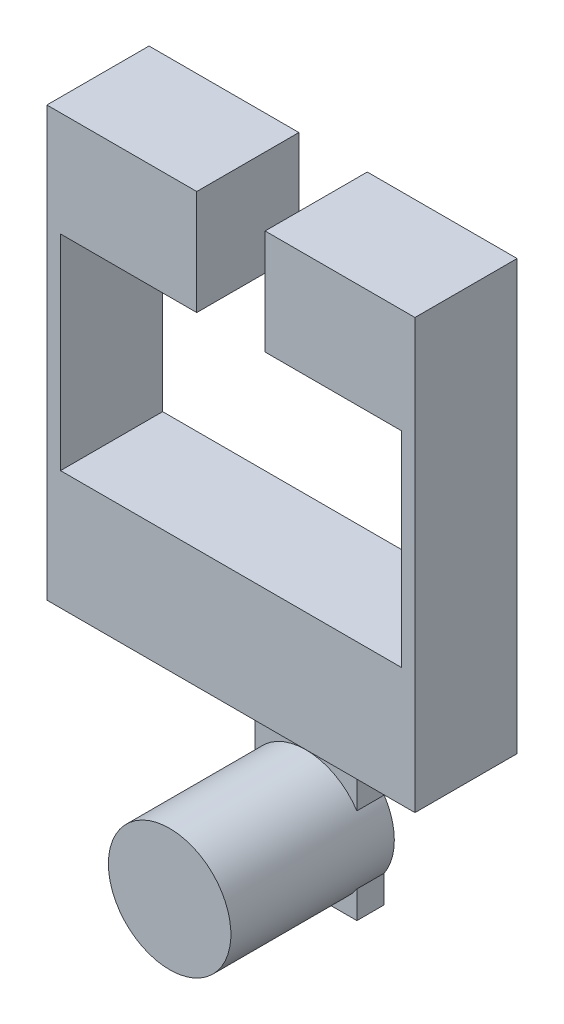
ISO-10303-21;
HEADER;
FILE_DESCRIPTION(('STEP AP214'),'2;1');
FILE_NAME('part.step','',(''),(''),'','','');
FILE_SCHEMA(('AUTOMOTIVE_DESIGN { 1 0 10303 214 1 1 1 1 }'));
ENDSEC;
DATA;
#1=APPLICATION_CONTEXT('core data for automotive mechanical design processes');
#2=APPLICATION_PROTOCOL_DEFINITION('international standard','automotive_design',2000,#1);
#3=PRODUCT_CONTEXT('',#1,'mechanical');
#4=PRODUCT('Part','Part','',(#3));
#5=PRODUCT_RELATED_PRODUCT_CATEGORY('part','',(#4));
#6=PRODUCT_DEFINITION_FORMATION('','',#4);
#7=PRODUCT_DEFINITION_CONTEXT('part definition',#1,'design');
#8=PRODUCT_DEFINITION('design','',#6,#7);
#9=PRODUCT_DEFINITION_SHAPE('','',#8);
#10=(LENGTH_UNIT() NAMED_UNIT(*) SI_UNIT(.MILLI.,.METRE.));
#11=(NAMED_UNIT(*) PLANE_ANGLE_UNIT() SI_UNIT($,.RADIAN.));
#12=(NAMED_UNIT(*) SI_UNIT($,.STERADIAN.) SOLID_ANGLE_UNIT());
#13=UNCERTAINTY_MEASURE_WITH_UNIT(LENGTH_MEASURE(1.E-05),#10,'distance_accuracy_value','');
#14=(GEOMETRIC_REPRESENTATION_CONTEXT(3) GLOBAL_UNCERTAINTY_ASSIGNED_CONTEXT((#13)) GLOBAL_UNIT_ASSIGNED_CONTEXT((#10,
#11,#12)) REPRESENTATION_CONTEXT('',''));
#15=CARTESIAN_POINT('',(0.,0.,0.));
#16=DIRECTION('',(0.,0.,1.));
#17=DIRECTION('',(1.,0.,0.));
#18=AXIS2_PLACEMENT_3D('',#15,#16,#17);
#19=CARTESIAN_POINT('',(9.52499999999999,0.,-4.445));
#20=DIRECTION('',(1.,0.,0.));
#21=DIRECTION('',(0.,1.,0.));
#22=AXIS2_PLACEMENT_3D('',#19,#20,#21);
#23=PLANE('',#22);
#24=DIRECTION('',(0.,0.,-1.));
#25=VECTOR('',#24,1.);
#26=CARTESIAN_POINT('',(9.52499999999998,-31.706675377923,20.955));
#27=LINE('',#26,#25);
#28=CARTESIAN_POINT('',(9.52499999999998,-31.706675377923,-4.445));
#29=VERTEX_POINT('',#28);
#30=CARTESIAN_POINT('',(9.52499999999998,-31.706675377923,-9.525));
#31=VERTEX_POINT('',#30);
#32=EDGE_CURVE('E197',#29,#31,#27,.T.);
#33=ORIENTED_EDGE('',*,*,#32,.F.);
#34=DIRECTION('',(0.,-1.,0.));
#35=VECTOR('',#34,1.);
#36=CARTESIAN_POINT('',(9.52499999999999,0.,-4.445));
#37=LINE('',#36,#35);
#38=CARTESIAN_POINT('',(9.52499999999998,-36.82365,-4.445));
#39=VERTEX_POINT('',#38);
#40=EDGE_CURVE('E219',#29,#39,#37,.T.);
#41=ORIENTED_EDGE('',*,*,#40,.T.);
#42=DIRECTION('',(0.,0.,-1.));
#43=VECTOR('',#42,1.);
#44=CARTESIAN_POINT('',(9.52499999999998,-36.82365,-4.445));
#45=LINE('',#44,#43);
#46=CARTESIAN_POINT('',(9.52499999999998,-36.82365,-9.525));
#47=VERTEX_POINT('',#46);
#48=EDGE_CURVE('E233',#39,#47,#45,.T.);
#49=ORIENTED_EDGE('',*,*,#48,.T.);
#50=DIRECTION('',(0.,-1.,0.));
#51=VECTOR('',#50,1.);
#52=CARTESIAN_POINT('',(9.52499999999999,0.,-9.525));
#53=LINE('',#52,#51);
#54=EDGE_CURVE('E399',#31,#47,#53,.T.);
#55=ORIENTED_EDGE('',*,*,#54,.F.);
#56=EDGE_LOOP('',(#33,#41,#49,#55));
#57=FACE_BOUND('',#56,.T.);
#58=ADVANCED_FACE('F46',(#57),#23,.T.);
#59=CARTESIAN_POINT('',(-9.52500000000001,0.,-4.445));
#60=DIRECTION('',(-1.,0.,0.));
#61=DIRECTION('',(0.,-1.,0.));
#62=AXIS2_PLACEMENT_3D('',#59,#60,#61);
#63=PLANE('',#62);
#64=DIRECTION('',(0.,0.,-1.));
#65=VECTOR('',#64,1.);
#66=CARTESIAN_POINT('',(-9.52500000000001,-19.093324622077,20.955));
#67=LINE('',#66,#65);
#68=CARTESIAN_POINT('',(-9.52500000000001,-19.093324622077,-4.445));
#69=VERTEX_POINT('',#68);
#70=CARTESIAN_POINT('',(-9.52500000000001,-19.093324622077,-9.525));
#71=VERTEX_POINT('',#70);
#72=EDGE_CURVE('E187',#69,#71,#67,.T.);
#73=ORIENTED_EDGE('',*,*,#72,.F.);
#74=DIRECTION('',(0.,1.,0.));
#75=VECTOR('',#74,1.);
#76=CARTESIAN_POINT('',(-9.52500000000001,0.,-4.445));
#77=LINE('',#76,#75);
#78=CARTESIAN_POINT('',(-9.52500000000001,0.,-4.445));
#79=VERTEX_POINT('',#78);
#80=EDGE_CURVE('E388',#69,#79,#77,.T.);
#81=ORIENTED_EDGE('',*,*,#80,.T.);
#82=DIRECTION('',(0.,0.,-1.));
#83=VECTOR('',#82,1.);
#84=CARTESIAN_POINT('',(-9.52500000000001,0.,-4.445));
#85=LINE('',#84,#83);
#86=CARTESIAN_POINT('',(-9.52500000000001,0.,-9.525));
#87=VERTEX_POINT('',#86);
#88=EDGE_CURVE('E211',#79,#87,#85,.T.);
#89=ORIENTED_EDGE('',*,*,#88,.T.);
#90=DIRECTION('',(0.,1.,0.));
#91=VECTOR('',#90,1.);
#92=CARTESIAN_POINT('',(-9.52500000000001,0.,-9.525));
#93=LINE('',#92,#91);
#94=EDGE_CURVE('E202',#71,#87,#93,.T.);
#95=ORIENTED_EDGE('',*,*,#94,.F.);
#96=EDGE_LOOP('',(#73,#81,#89,#95));
#97=FACE_BOUND('',#96,.T.);
#98=ADVANCED_FACE('F209',(#97),#63,.T.);
#99=CARTESIAN_POINT('',(0.,0.,-4.445));
#100=DIRECTION('',(0.,0.,-1.));
#101=DIRECTION('',(-1.,0.,0.));
#102=AXIS2_PLACEMENT_3D('',#99,#100,#101);
#103=PLANE('',#102);
#104=ORIENTED_EDGE('',*,*,#80,.F.);
#105=CARTESIAN_POINT('',(0.,-25.4,-4.445));
#106=DIRECTION('',(0.,0.,-1.));
#107=DIRECTION('',(-1.,0.,0.));
#108=AXIS2_PLACEMENT_3D('',#105,#106,#107);
#109=CIRCLE('',#108,11.42365);
#110=CARTESIAN_POINT('',(9.52499999999999,-19.093324622077,-4.445));
#111=VERTEX_POINT('',#110);
#112=EDGE_CURVE('E11',#69,#111,#109,.T.);
#113=ORIENTED_EDGE('',*,*,#112,.T.);
#114=CARTESIAN_POINT('',(9.52499999999999,0.,-4.445));
#115=VERTEX_POINT('',#114);
#116=EDGE_CURVE('E382',#115,#111,#37,.T.);
#117=ORIENTED_EDGE('',*,*,#116,.F.);
#118=DIRECTION('',(1.,0.,0.));
#119=VECTOR('',#118,1.);
#120=CARTESIAN_POINT('',(9.52499999999999,0.,-4.445));
#121=LINE('',#120,#119);
#122=EDGE_CURVE('E237',#79,#115,#121,.T.);
#123=ORIENTED_EDGE('',*,*,#122,.F.);
#124=EDGE_LOOP('',(#104,#113,#117,#123));
#125=FACE_BOUND('',#124,.T.);
#126=ADVANCED_FACE('F435',(#125),#103,.F.);
#127=ORIENTED_EDGE('',*,*,#40,.F.);
#128=CARTESIAN_POINT('',(0.,-36.82365,-4.445));
#129=VERTEX_POINT('',#128);
#130=EDGE_CURVE('E56',#29,#129,#109,.T.);
#131=ORIENTED_EDGE('',*,*,#130,.T.);
#132=DIRECTION('',(-1.,0.,0.));
#133=VECTOR('',#132,1.);
#134=CARTESIAN_POINT('',(9.52499999999998,-36.82365,-4.445));
#135=LINE('',#134,#133);
#136=EDGE_CURVE('E374',#39,#129,#135,.T.);
#137=ORIENTED_EDGE('',*,*,#136,.F.);
#138=EDGE_LOOP('',(#127,#131,#137));
#139=FACE_BOUND('',#138,.T.);
#140=ADVANCED_FACE('F372',(#139),#103,.F.);
#141=CARTESIAN_POINT('',(-34.32048,0.,9.525));
#142=DIRECTION('',(0.,1.,0.));
#143=DIRECTION('',(0.,0.,1.));
#144=AXIS2_PLACEMENT_3D('',#141,#142,#143);
#145=PLANE('',#144);
#146=ORIENTED_EDGE('',*,*,#88,.F.);
#147=ORIENTED_EDGE('',*,*,#122,.T.);
#148=DIRECTION('',(0.,0.,-1.));
#149=VECTOR('',#148,1.);
#150=CARTESIAN_POINT('',(9.52499999999999,0.,-4.445));
#151=LINE('',#150,#149);
#152=CARTESIAN_POINT('',(9.52499999999999,0.,-9.525));
#153=VERTEX_POINT('',#152);
#154=EDGE_CURVE('E223',#115,#153,#151,.T.);
#155=ORIENTED_EDGE('',*,*,#154,.T.);
#156=DIRECTION('',(1.,0.,0.));
#157=VECTOR('',#156,1.);
#158=CARTESIAN_POINT('',(-34.32048,0.,-9.525));
#159=LINE('',#158,#157);
#160=CARTESIAN_POINT('',(34.32048,0.,-9.525));
#161=VERTEX_POINT('',#160);
#162=EDGE_CURVE('E333',#153,#161,#159,.T.);
#163=ORIENTED_EDGE('',*,*,#162,.T.);
#164=DIRECTION('',(0.,0.,-1.));
#165=VECTOR('',#164,1.);
#166=CARTESIAN_POINT('',(34.32048,0.,9.525));
#167=LINE('',#166,#165);
#168=CARTESIAN_POINT('',(34.32048,0.,9.525));
#169=VERTEX_POINT('',#168);
#170=EDGE_CURVE('E351',#169,#161,#167,.T.);
#171=ORIENTED_EDGE('',*,*,#170,.F.);
#172=DIRECTION('',(1.,0.,0.));
#173=VECTOR('',#172,1.);
#174=CARTESIAN_POINT('',(-34.32048,0.,9.525));
#175=LINE('',#174,#173);
#176=CARTESIAN_POINT('',(-34.32048,0.,9.525));
#177=VERTEX_POINT('',#176);
#178=EDGE_CURVE('E317',#177,#169,#175,.T.);
#179=ORIENTED_EDGE('',*,*,#178,.F.);
#180=DIRECTION('',(0.,0.,-1.));
#181=VECTOR('',#180,1.);
#182=CARTESIAN_POINT('',(-34.32048,0.,9.525));
#183=LINE('',#182,#181);
#184=CARTESIAN_POINT('',(-34.32048,0.,-9.525));
#185=VERTEX_POINT('',#184);
#186=EDGE_CURVE('E354',#177,#185,#183,.T.);
#187=ORIENTED_EDGE('',*,*,#186,.T.);
#188=EDGE_CURVE('E334',#185,#87,#159,.T.);
#189=ORIENTED_EDGE('',*,*,#188,.T.);
#190=EDGE_LOOP('',(#146,#147,#155,#163,#171,#179,#187,#189));
#191=FACE_BOUND('',#190,.T.);
#192=ADVANCED_FACE('F479',(#191),#145,.F.);
#193=CARTESIAN_POINT('',(-34.32048,79.9750208357062,9.525));
#194=DIRECTION('',(0.,-1.,0.));
#195=DIRECTION('',(0.,0.,-1.));
#196=AXIS2_PLACEMENT_3D('',#193,#194,#195);
#197=PLANE('',#196);
#198=DIRECTION('',(-1.,0.,0.));
#199=VECTOR('',#198,1.);
#200=CARTESIAN_POINT('',(-34.32048,79.9750208357062,9.525));
#201=LINE('',#200,#199);
#202=CARTESIAN_POINT('',(-6.3754,79.9750208357062,9.525));
#203=VERTEX_POINT('',#202);
#204=CARTESIAN_POINT('',(-34.32048,79.9750208357062,9.525));
#205=VERTEX_POINT('',#204);
#206=EDGE_CURVE('E324',#203,#205,#201,.T.);
#207=ORIENTED_EDGE('',*,*,#206,.F.);
#208=DIRECTION('',(0.,0.,1.));
#209=VECTOR('',#208,1.);
#210=CARTESIAN_POINT('',(-6.3754,79.9750208357062,-9.525));
#211=LINE('',#210,#209);
#212=CARTESIAN_POINT('',(-6.3754,79.9750208357062,-9.525));
#213=VERTEX_POINT('',#212);
#214=EDGE_CURVE('E252',#213,#203,#211,.T.);
#215=ORIENTED_EDGE('',*,*,#214,.F.);
#216=DIRECTION('',(-1.,0.,0.));
#217=VECTOR('',#216,1.);
#218=CARTESIAN_POINT('',(-34.32048,79.9750208357062,-9.525));
#219=LINE('',#218,#217);
#220=CARTESIAN_POINT('',(-34.32048,79.9750208357062,-9.525));
#221=VERTEX_POINT('',#220);
#222=EDGE_CURVE('E340',#213,#221,#219,.T.);
#223=ORIENTED_EDGE('',*,*,#222,.T.);
#224=DIRECTION('',(0.,0.,-1.));
#225=VECTOR('',#224,1.);
#226=CARTESIAN_POINT('',(-34.32048,79.9750208357062,9.525));
#227=LINE('',#226,#225);
#228=EDGE_CURVE('E329',#205,#221,#227,.T.);
#229=ORIENTED_EDGE('',*,*,#228,.F.);
#230=EDGE_LOOP('',(#207,#215,#223,#229));
#231=FACE_BOUND('',#230,.T.);
#232=ADVANCED_FACE('F476',(#231),#197,.F.);
#233=CARTESIAN_POINT('',(-31.78048,60.4170208357062,-9.525));
#234=DIRECTION('',(0.,1.,0.));
#235=DIRECTION('',(-1.,0.,0.));
#236=AXIS2_PLACEMENT_3D('',#233,#234,#235);
#237=PLANE('',#236);
#238=DIRECTION('',(-1.,0.,0.));
#239=VECTOR('',#238,1.);
#240=CARTESIAN_POINT('',(-31.78048,60.4170208357062,-9.525));
#241=LINE('',#240,#239);
#242=CARTESIAN_POINT('',(-6.3754,60.4170208357062,-9.525));
#243=VERTEX_POINT('',#242);
#244=CARTESIAN_POINT('',(-31.78048,60.4170208357062,-9.525));
#245=VERTEX_POINT('',#244);
#246=EDGE_CURVE('E279',#243,#245,#241,.T.);
#247=ORIENTED_EDGE('',*,*,#246,.F.);
#248=DIRECTION('',(0.,0.,1.));
#249=VECTOR('',#248,1.);
#250=CARTESIAN_POINT('',(-6.3754,60.4170208357062,-9.525));
#251=LINE('',#250,#249);
#252=CARTESIAN_POINT('',(-6.3754,60.4170208357062,9.525));
#253=VERTEX_POINT('',#252);
#254=EDGE_CURVE('E247',#243,#253,#251,.T.);
#255=ORIENTED_EDGE('',*,*,#254,.T.);
#256=DIRECTION('',(-1.,0.,0.));
#257=VECTOR('',#256,1.);
#258=CARTESIAN_POINT('',(-31.78048,60.4170208357062,9.525));
#259=LINE('',#258,#257);
#260=CARTESIAN_POINT('',(-31.78048,60.4170208357062,9.525));
#261=VERTEX_POINT('',#260);
#262=EDGE_CURVE('E295',#253,#261,#259,.T.);
#263=ORIENTED_EDGE('',*,*,#262,.T.);
#264=DIRECTION('',(0.,0.,1.));
#265=VECTOR('',#264,1.);
#266=CARTESIAN_POINT('',(-31.78048,60.4170208357062,-9.525));
#267=LINE('',#266,#265);
#268=EDGE_CURVE('E299',#245,#261,#267,.T.);
#269=ORIENTED_EDGE('',*,*,#268,.F.);
#270=EDGE_LOOP('',(#247,#255,#263,#269));
#271=FACE_BOUND('',#270,.T.);
#272=ADVANCED_FACE('F455',(#271),#237,.F.);
#273=CARTESIAN_POINT('',(-34.32048,79.9750208357062,9.525));
#274=DIRECTION('',(1.,0.,0.));
#275=DIRECTION('',(0.,1.,0.));
#276=AXIS2_PLACEMENT_3D('',#273,#274,#275);
#277=PLANE('',#276);
#278=DIRECTION('',(0.,-1.,0.));
#279=VECTOR('',#278,1.);
#280=CARTESIAN_POINT('',(-34.32048,79.9750208357062,-9.525));
#281=LINE('',#280,#279);
#282=EDGE_CURVE('E303',#221,#185,#281,.T.);
#283=ORIENTED_EDGE('',*,*,#282,.T.);
#284=ORIENTED_EDGE('',*,*,#186,.F.);
#285=DIRECTION('',(0.,-1.,0.));
#286=VECTOR('',#285,1.);
#287=CARTESIAN_POINT('',(-34.32048,79.9750208357062,9.525));
#288=LINE('',#287,#286);
#289=EDGE_CURVE('E313',#205,#177,#288,.T.);
#290=ORIENTED_EDGE('',*,*,#289,.F.);
#291=ORIENTED_EDGE('',*,*,#228,.T.);
#292=EDGE_LOOP('',(#283,#284,#290,#291));
#293=FACE_BOUND('',#292,.T.);
#294=ADVANCED_FACE('F48',(#293),#277,.F.);
#295=CARTESIAN_POINT('',(34.32048,79.9750208357062,9.525));
#296=DIRECTION('',(-1.,0.,0.));
#297=DIRECTION('',(0.,-1.,0.));
#298=AXIS2_PLACEMENT_3D('',#295,#296,#297);
#299=PLANE('',#298);
#300=DIRECTION('',(0.,1.,0.));
#301=VECTOR('',#300,1.);
#302=CARTESIAN_POINT('',(34.32048,79.9750208357062,-9.525));
#303=LINE('',#302,#301);
#304=CARTESIAN_POINT('',(34.32048,79.9750208357062,-9.525));
#305=VERTEX_POINT('',#304);
#306=EDGE_CURVE('E337',#161,#305,#303,.T.);
#307=ORIENTED_EDGE('',*,*,#306,.T.);
#308=DIRECTION('',(0.,0.,-1.));
#309=VECTOR('',#308,1.);
#310=CARTESIAN_POINT('',(34.32048,79.9750208357062,9.525));
#311=LINE('',#310,#309);
#312=CARTESIAN_POINT('',(34.32048,79.9750208357062,9.525));
#313=VERTEX_POINT('',#312);
#314=EDGE_CURVE('E347',#313,#305,#311,.T.);
#315=ORIENTED_EDGE('',*,*,#314,.F.);
#316=DIRECTION('',(0.,1.,0.));
#317=VECTOR('',#316,1.);
#318=CARTESIAN_POINT('',(34.32048,79.9750208357062,9.525));
#319=LINE('',#318,#317);
#320=EDGE_CURVE('E321',#169,#313,#319,.T.);
#321=ORIENTED_EDGE('',*,*,#320,.F.);
#322=ORIENTED_EDGE('',*,*,#170,.T.);
#323=EDGE_LOOP('',(#307,#315,#321,#322));
#324=FACE_BOUND('',#323,.T.);
#325=ADVANCED_FACE('F474',(#324),#299,.F.);
#326=CARTESIAN_POINT('',(6.3754,79.9750208357062,-9.525));
#327=VERTEX_POINT('',#326);
#328=EDGE_CURVE('E318',#305,#327,#219,.T.);
#329=ORIENTED_EDGE('',*,*,#328,.T.);
#330=DIRECTION('',(0.,0.,1.));
#331=VECTOR('',#330,1.);
#332=CARTESIAN_POINT('',(6.3754,79.9750208357062,-9.525));
#333=LINE('',#332,#331);
#334=CARTESIAN_POINT('',(6.3754,79.9750208357062,9.525));
#335=VERTEX_POINT('',#334);
#336=EDGE_CURVE('E256',#327,#335,#333,.T.);
#337=ORIENTED_EDGE('',*,*,#336,.T.);
#338=EDGE_CURVE('E325',#313,#335,#201,.T.);
#339=ORIENTED_EDGE('',*,*,#338,.F.);
#340=ORIENTED_EDGE('',*,*,#314,.T.);
#341=EDGE_LOOP('',(#329,#337,#339,#340));
#342=FACE_BOUND('',#341,.T.);
#343=ADVANCED_FACE('F468',(#342),#197,.F.);
#344=CARTESIAN_POINT('',(0.,0.,9.525));
#345=DIRECTION('',(0.,0.,1.));
#346=DIRECTION('',(1.,0.,0.));
#347=AXIS2_PLACEMENT_3D('',#344,#345,#346);
#348=PLANE('',#347);
#349=DIRECTION('',(0.,-1.,0.));
#350=VECTOR('',#349,1.);
#351=CARTESIAN_POINT('',(-6.3754,79.9750208357062,9.525));
#352=LINE('',#351,#350);
#353=EDGE_CURVE('E226',#203,#253,#352,.T.);
#354=ORIENTED_EDGE('',*,*,#353,.F.);
#355=ORIENTED_EDGE('',*,*,#206,.T.);
#356=ORIENTED_EDGE('',*,*,#289,.T.);
#357=ORIENTED_EDGE('',*,*,#178,.T.);
#358=ORIENTED_EDGE('',*,*,#320,.T.);
#359=ORIENTED_EDGE('',*,*,#338,.T.);
#360=DIRECTION('',(0.,1.,0.));
#361=VECTOR('',#360,1.);
#362=CARTESIAN_POINT('',(6.3754,79.9750208357062,9.525));
#363=LINE('',#362,#361);
#364=CARTESIAN_POINT('',(6.3754,60.4170208357062,9.525));
#365=VERTEX_POINT('',#364);
#366=EDGE_CURVE('E243',#365,#335,#363,.T.);
#367=ORIENTED_EDGE('',*,*,#366,.F.);
#368=CARTESIAN_POINT('',(31.78048,60.4170208357062,9.525));
#369=VERTEX_POINT('',#368);
#370=EDGE_CURVE('E271',#369,#365,#259,.T.);
#371=ORIENTED_EDGE('',*,*,#370,.F.);
#372=DIRECTION('',(0.,1.,0.));
#373=VECTOR('',#372,1.);
#374=CARTESIAN_POINT('',(31.78048,60.4170208357062,9.525));
#375=LINE('',#374,#373);
#376=CARTESIAN_POINT('',(31.78048,22.1900208357063,9.525));
#377=VERTEX_POINT('',#376);
#378=EDGE_CURVE('E291',#377,#369,#375,.T.);
#379=ORIENTED_EDGE('',*,*,#378,.F.);
#380=DIRECTION('',(1.,0.,0.));
#381=VECTOR('',#380,1.);
#382=CARTESIAN_POINT('',(-31.78048,22.1900208357062,9.525));
#383=LINE('',#382,#381);
#384=CARTESIAN_POINT('',(-31.78048,22.1900208357062,9.525));
#385=VERTEX_POINT('',#384);
#386=EDGE_CURVE('E287',#385,#377,#383,.T.);
#387=ORIENTED_EDGE('',*,*,#386,.F.);
#388=DIRECTION('',(0.,-1.,0.));
#389=VECTOR('',#388,1.);
#390=CARTESIAN_POINT('',(-31.78048,60.4170208357062,9.525));
#391=LINE('',#390,#389);
#392=EDGE_CURVE('E255',#261,#385,#391,.T.);
#393=ORIENTED_EDGE('',*,*,#392,.F.);
#394=ORIENTED_EDGE('',*,*,#262,.F.);
#395=EDGE_LOOP('',(#354,#355,#356,#357,#358,#359,#367,#371,#379,#387,#393,#394));
#396=FACE_BOUND('',#395,.T.);
#397=ADVANCED_FACE('F465',(#396),#348,.T.);
#398=CARTESIAN_POINT('',(0.,0.,-9.525));
#399=DIRECTION('',(0.,0.,1.));
#400=DIRECTION('',(1.,0.,0.));
#401=AXIS2_PLACEMENT_3D('',#398,#399,#400);
#402=PLANE('',#401);
#403=DIRECTION('',(-1.,0.,0.));
#404=VECTOR('',#403,1.);
#405=CARTESIAN_POINT('',(9.52499999999998,-36.82365,-9.525));
#406=LINE('',#405,#404);
#407=CARTESIAN_POINT('',(-9.52500000000002,-36.82365,-9.525));
#408=VERTEX_POINT('',#407);
#409=EDGE_CURVE('E214',#47,#408,#406,.T.);
#410=ORIENTED_EDGE('',*,*,#409,.T.);
#411=CARTESIAN_POINT('',(-9.52500000000001,-31.706675377923,-9.525));
#412=VERTEX_POINT('',#411);
#413=EDGE_CURVE('E205',#408,#412,#93,.T.);
#414=ORIENTED_EDGE('',*,*,#413,.T.);
#415=CARTESIAN_POINT('',(0.,-25.4,-9.525));
#416=DIRECTION('',(0.,0.,-1.));
#417=DIRECTION('',(-1.,0.,0.));
#418=AXIS2_PLACEMENT_3D('',#415,#416,#417);
#419=CIRCLE('',#418,11.42365);
#420=EDGE_CURVE('E191',#412,#71,#419,.T.);
#421=ORIENTED_EDGE('',*,*,#420,.T.);
#422=ORIENTED_EDGE('',*,*,#94,.T.);
#423=ORIENTED_EDGE('',*,*,#188,.F.);
#424=ORIENTED_EDGE('',*,*,#282,.F.);
#425=ORIENTED_EDGE('',*,*,#222,.F.);
#426=DIRECTION('',(0.,-1.,0.));
#427=VECTOR('',#426,1.);
#428=CARTESIAN_POINT('',(-6.3754,79.9750208357062,-9.525));
#429=LINE('',#428,#427);
#430=EDGE_CURVE('E238',#213,#243,#429,.T.);
#431=ORIENTED_EDGE('',*,*,#430,.T.);
#432=ORIENTED_EDGE('',*,*,#246,.T.);
#433=DIRECTION('',(0.,-1.,0.));
#434=VECTOR('',#433,1.);
#435=CARTESIAN_POINT('',(-31.78048,60.4170208357062,-9.525));
#436=LINE('',#435,#434);
#437=CARTESIAN_POINT('',(-31.78048,22.1900208357062,-9.525));
#438=VERTEX_POINT('',#437);
#439=EDGE_CURVE('E266',#245,#438,#436,.T.);
#440=ORIENTED_EDGE('',*,*,#439,.T.);
#441=DIRECTION('',(1.,0.,0.));
#442=VECTOR('',#441,1.);
#443=CARTESIAN_POINT('',(-31.78048,22.1900208357062,-9.525));
#444=LINE('',#443,#442);
#445=CARTESIAN_POINT('',(31.78048,22.1900208357063,-9.525));
#446=VERTEX_POINT('',#445);
#447=EDGE_CURVE('E270',#438,#446,#444,.T.);
#448=ORIENTED_EDGE('',*,*,#447,.T.);
#449=DIRECTION('',(0.,1.,0.));
#450=VECTOR('',#449,1.);
#451=CARTESIAN_POINT('',(31.78048,60.4170208357062,-9.525));
#452=LINE('',#451,#450);
#453=CARTESIAN_POINT('',(31.78048,60.4170208357062,-9.525));
#454=VERTEX_POINT('',#453);
#455=EDGE_CURVE('E275',#446,#454,#452,.T.);
#456=ORIENTED_EDGE('',*,*,#455,.T.);
#457=CARTESIAN_POINT('',(6.3754,60.4170208357062,-9.525));
#458=VERTEX_POINT('',#457);
#459=EDGE_CURVE('E280',#454,#458,#241,.T.);
#460=ORIENTED_EDGE('',*,*,#459,.T.);
#461=DIRECTION('',(0.,1.,0.));
#462=VECTOR('',#461,1.);
#463=CARTESIAN_POINT('',(6.3754,79.9750208357062,-9.525));
#464=LINE('',#463,#462);
#465=EDGE_CURVE('E242',#458,#327,#464,.T.);
#466=ORIENTED_EDGE('',*,*,#465,.T.);
#467=ORIENTED_EDGE('',*,*,#328,.F.);
#468=ORIENTED_EDGE('',*,*,#306,.F.);
#469=ORIENTED_EDGE('',*,*,#162,.F.);
#470=CARTESIAN_POINT('',(9.52499999999999,-19.093324622077,-9.525));
#471=VERTEX_POINT('',#470);
#472=EDGE_CURVE('E71',#153,#471,#53,.T.);
#473=ORIENTED_EDGE('',*,*,#472,.T.);
#474=EDGE_CURVE('E207',#471,#31,#419,.T.);
#475=ORIENTED_EDGE('',*,*,#474,.T.);
#476=ORIENTED_EDGE('',*,*,#54,.T.);
#477=EDGE_LOOP('',(#410,#414,#421,#422,#423,#424,#425,#431,#432,#440,#448,#456,#460,#466,#467,
#468,#469,#473,#475,#476));
#478=FACE_BOUND('',#477,.T.);
#479=ADVANCED_FACE('F201',(#478),#402,.F.);
#480=CARTESIAN_POINT('',(-31.78048,60.4170208357062,-9.525));
#481=DIRECTION('',(-1.,0.,0.));
#482=DIRECTION('',(0.,-1.,0.));
#483=AXIS2_PLACEMENT_3D('',#480,#481,#482);
#484=PLANE('',#483);
#485=ORIENTED_EDGE('',*,*,#392,.T.);
#486=DIRECTION('',(0.,0.,1.));
#487=VECTOR('',#486,1.);
#488=CARTESIAN_POINT('',(-31.78048,22.1900208357062,-9.525));
#489=LINE('',#488,#487);
#490=EDGE_CURVE('E284',#438,#385,#489,.T.);
#491=ORIENTED_EDGE('',*,*,#490,.F.);
#492=ORIENTED_EDGE('',*,*,#439,.F.);
#493=ORIENTED_EDGE('',*,*,#268,.T.);
#494=EDGE_LOOP('',(#485,#491,#492,#493));
#495=FACE_BOUND('',#494,.T.);
#496=ADVANCED_FACE('F453',(#495),#484,.F.);
#497=ORIENTED_EDGE('',*,*,#370,.T.);
#498=DIRECTION('',(0.,0.,1.));
#499=VECTOR('',#498,1.);
#500=CARTESIAN_POINT('',(6.3754,60.4170208357062,-9.525));
#501=LINE('',#500,#499);
#502=EDGE_CURVE('E260',#458,#365,#501,.T.);
#503=ORIENTED_EDGE('',*,*,#502,.F.);
#504=ORIENTED_EDGE('',*,*,#459,.F.);
#505=DIRECTION('',(0.,0.,1.));
#506=VECTOR('',#505,1.);
#507=CARTESIAN_POINT('',(31.78048,60.4170208357062,-9.525));
#508=LINE('',#507,#506);
#509=EDGE_CURVE('E304',#454,#369,#508,.T.);
#510=ORIENTED_EDGE('',*,*,#509,.T.);
#511=EDGE_LOOP('',(#497,#503,#504,#510));
#512=FACE_BOUND('',#511,.T.);
#513=ADVANCED_FACE('F449',(#512),#237,.F.);
#514=CARTESIAN_POINT('',(31.78048,60.4170208357062,-9.525));
#515=DIRECTION('',(1.,0.,0.));
#516=DIRECTION('',(0.,1.,0.));
#517=AXIS2_PLACEMENT_3D('',#514,#515,#516);
#518=PLANE('',#517);
#519=ORIENTED_EDGE('',*,*,#378,.T.);
#520=ORIENTED_EDGE('',*,*,#509,.F.);
#521=ORIENTED_EDGE('',*,*,#455,.F.);
#522=DIRECTION('',(0.,0.,1.));
#523=VECTOR('',#522,1.);
#524=CARTESIAN_POINT('',(31.78048,22.1900208357063,-9.525));
#525=LINE('',#524,#523);
#526=EDGE_CURVE('E307',#446,#377,#525,.T.);
#527=ORIENTED_EDGE('',*,*,#526,.T.);
#528=EDGE_LOOP('',(#519,#520,#521,#527));
#529=FACE_BOUND('',#528,.T.);
#530=ADVANCED_FACE('F452',(#529),#518,.F.);
#531=CARTESIAN_POINT('',(-31.78048,22.1900208357062,-9.525));
#532=DIRECTION('',(0.,-1.,0.));
#533=DIRECTION('',(1.,0.,0.));
#534=AXIS2_PLACEMENT_3D('',#531,#532,#533);
#535=PLANE('',#534);
#536=ORIENTED_EDGE('',*,*,#386,.T.);
#537=ORIENTED_EDGE('',*,*,#526,.F.);
#538=ORIENTED_EDGE('',*,*,#447,.F.);
#539=ORIENTED_EDGE('',*,*,#490,.T.);
#540=EDGE_LOOP('',(#536,#537,#538,#539));
#541=FACE_BOUND('',#540,.T.);
#542=ADVANCED_FACE('F444',(#541),#535,.F.);
#543=CARTESIAN_POINT('',(6.3754,79.9750208357062,-9.525));
#544=DIRECTION('',(1.,0.,0.));
#545=DIRECTION('',(0.,1.,0.));
#546=AXIS2_PLACEMENT_3D('',#543,#544,#545);
#547=PLANE('',#546);
#548=ORIENTED_EDGE('',*,*,#366,.T.);
#549=ORIENTED_EDGE('',*,*,#336,.F.);
#550=ORIENTED_EDGE('',*,*,#465,.F.);
#551=ORIENTED_EDGE('',*,*,#502,.T.);
#552=EDGE_LOOP('',(#548,#549,#550,#551));
#553=FACE_BOUND('',#552,.T.);
#554=ADVANCED_FACE('F441',(#553),#547,.F.);
#555=CARTESIAN_POINT('',(-6.3754,79.9750208357062,-9.525));
#556=DIRECTION('',(-1.,0.,0.));
#557=DIRECTION('',(0.,-1.,0.));
#558=AXIS2_PLACEMENT_3D('',#555,#556,#557);
#559=PLANE('',#558);
#560=ORIENTED_EDGE('',*,*,#353,.T.);
#561=ORIENTED_EDGE('',*,*,#254,.F.);
#562=ORIENTED_EDGE('',*,*,#430,.F.);
#563=ORIENTED_EDGE('',*,*,#214,.T.);
#564=EDGE_LOOP('',(#560,#561,#562,#563));
#565=FACE_BOUND('',#564,.T.);
#566=ADVANCED_FACE('F431',(#565),#559,.F.);
#567=DIRECTION('',(0.,0.,-1.));
#568=VECTOR('',#567,1.);
#569=CARTESIAN_POINT('',(9.52499999999999,-19.093324622077,20.955));
#570=LINE('',#569,#568);
#571=EDGE_CURVE('E196',#471,#111,#570,.F.);
#572=ORIENTED_EDGE('',*,*,#571,.F.);
#573=ORIENTED_EDGE('',*,*,#472,.F.);
#574=ORIENTED_EDGE('',*,*,#154,.F.);
#575=ORIENTED_EDGE('',*,*,#116,.T.);
#576=EDGE_LOOP('',(#572,#573,#574,#575));
#577=FACE_BOUND('',#576,.T.);
#578=ADVANCED_FACE('F424',(#577),#23,.T.);
#579=DIRECTION('',(0.,0.,-1.));
#580=VECTOR('',#579,1.);
#581=CARTESIAN_POINT('',(-9.52500000000001,-31.706675377923,20.955));
#582=LINE('',#581,#580);
#583=CARTESIAN_POINT('',(-9.52500000000001,-31.706675377923,-4.445));
#584=VERTEX_POINT('',#583);
#585=EDGE_CURVE('E63',#412,#584,#582,.F.);
#586=ORIENTED_EDGE('',*,*,#585,.F.);
#587=ORIENTED_EDGE('',*,*,#413,.F.);
#588=DIRECTION('',(0.,0.,-1.));
#589=VECTOR('',#588,1.);
#590=CARTESIAN_POINT('',(-9.52500000000002,-36.82365,-4.445));
#591=LINE('',#590,#589);
#592=CARTESIAN_POINT('',(-9.52500000000002,-36.82365,-4.445));
#593=VERTEX_POINT('',#592);
#594=EDGE_CURVE('E229',#593,#408,#591,.T.);
#595=ORIENTED_EDGE('',*,*,#594,.F.);
#596=EDGE_CURVE('E378',#593,#584,#77,.T.);
#597=ORIENTED_EDGE('',*,*,#596,.T.);
#598=EDGE_LOOP('',(#586,#587,#595,#597));
#599=FACE_BOUND('',#598,.T.);
#600=ADVANCED_FACE('F422',(#599),#63,.T.);
#601=CARTESIAN_POINT('',(9.52499999999998,-36.82365,-4.445));
#602=DIRECTION('',(0.,-1.,0.));
#603=DIRECTION('',(1.,0.,0.));
#604=AXIS2_PLACEMENT_3D('',#601,#602,#603);
#605=PLANE('',#604);
#606=ORIENTED_EDGE('',*,*,#594,.T.);
#607=ORIENTED_EDGE('',*,*,#409,.F.);
#608=ORIENTED_EDGE('',*,*,#48,.F.);
#609=ORIENTED_EDGE('',*,*,#136,.T.);
#610=EDGE_CURVE('E376',#129,#593,#135,.T.);
#611=ORIENTED_EDGE('',*,*,#610,.T.);
#612=EDGE_LOOP('',(#606,#607,#608,#609,#611));
#613=FACE_BOUND('',#612,.T.);
#614=ADVANCED_FACE('F385',(#613),#605,.T.);
#615=ORIENTED_EDGE('',*,*,#610,.F.);
#616=EDGE_CURVE('E50',#129,#584,#109,.T.);
#617=ORIENTED_EDGE('',*,*,#616,.T.);
#618=ORIENTED_EDGE('',*,*,#596,.F.);
#619=EDGE_LOOP('',(#615,#617,#618));
#620=FACE_BOUND('',#619,.T.);
#621=ADVANCED_FACE('F377',(#620),#103,.F.);
#622=CARTESIAN_POINT('',(0.,-25.4,20.955));
#623=DIRECTION('',(0.,0.,-1.));
#624=DIRECTION('',(-1.,0.,0.));
#625=AXIS2_PLACEMENT_3D('',#622,#623,#624);
#626=CYLINDRICAL_SURFACE('',#625,11.42365);
#627=ORIENTED_EDGE('',*,*,#474,.F.);
#628=ORIENTED_EDGE('',*,*,#571,.T.);
#629=ORIENTED_EDGE('',*,*,#112,.F.);
#630=ORIENTED_EDGE('',*,*,#72,.T.);
#631=ORIENTED_EDGE('',*,*,#420,.F.);
#632=ORIENTED_EDGE('',*,*,#585,.T.);
#633=ORIENTED_EDGE('',*,*,#616,.F.);
#634=ORIENTED_EDGE('',*,*,#130,.F.);
#635=ORIENTED_EDGE('',*,*,#32,.T.);
#636=EDGE_LOOP('',(#627,#628,#629,#630,#631,#632,#633,#634,#635));
#637=FACE_BOUND('',#636,.T.);
#638=CARTESIAN_POINT('',(0.,-25.4,20.955));
#639=DIRECTION('',(0.,0.,-1.));
#640=DIRECTION('',(-1.,0.,0.));
#641=AXIS2_PLACEMENT_3D('',#638,#639,#640);
#642=CIRCLE('',#641,11.42365);
#643=CARTESIAN_POINT('',(-11.42365,-25.4,20.955));
#644=VERTEX_POINT('',#643);
#645=EDGE_CURVE('E412',#644,#644,#642,.T.);
#646=ORIENTED_EDGE('',*,*,#645,.T.);
#647=EDGE_LOOP('',(#646));
#648=FACE_BOUND('',#647,.T.);
#649=ADVANCED_FACE('F189',(#637,#648),#626,.T.);
#650=CARTESIAN_POINT('',(0.,-25.4,20.955));
#651=DIRECTION('',(0.,0.,-1.));
#652=DIRECTION('',(-1.,0.,0.));
#653=AXIS2_PLACEMENT_3D('',#650,#651,#652);
#654=PLANE('',#653);
#655=ORIENTED_EDGE('',*,*,#645,.F.);
#656=EDGE_LOOP('',(#655));
#657=FACE_BOUND('',#656,.T.);
#658=ADVANCED_FACE('F604',(#657),#654,.F.);
#659=CLOSED_SHELL('',(#58,#98,#126,#140,#192,#232,#272,#294,#325,#343,#397,#479,#496,#513,#530,
#542,#554,#566,#578,#600,#614,#621,#649,#658));
#660=MANIFOLD_SOLID_BREP('B2',#659);
#661=ADVANCED_BREP_SHAPE_REPRESENTATION('',(#18,#660),#14);
#662=SHAPE_DEFINITION_REPRESENTATION(#9,#661);
ENDSEC;
END-ISO-10303-21;
